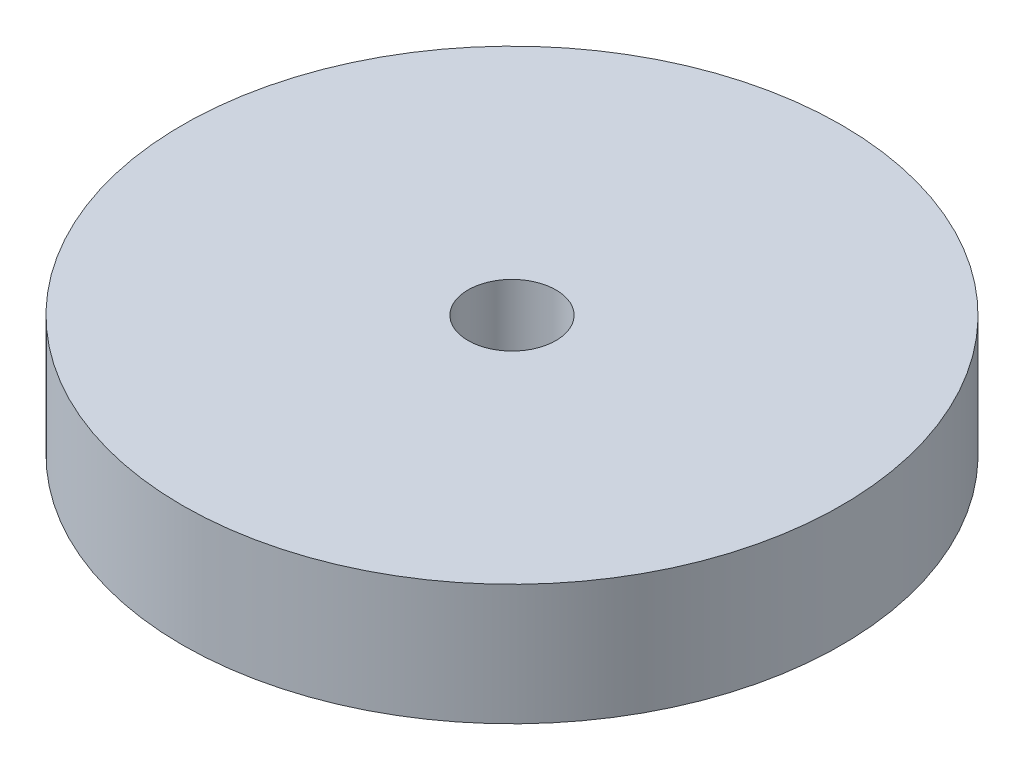
ISO-10303-21;
HEADER;
FILE_DESCRIPTION(('STEP AP214'),'2;1');
FILE_NAME('part.step','',(''),(''),'','','');
FILE_SCHEMA(('AUTOMOTIVE_DESIGN { 1 0 10303 214 1 1 1 1 }'));
ENDSEC;
DATA;
#1=APPLICATION_CONTEXT('core data for automotive mechanical design processes');
#2=APPLICATION_PROTOCOL_DEFINITION('international standard','automotive_design',2000,#1);
#3=PRODUCT_CONTEXT('',#1,'mechanical');
#4=PRODUCT('Part','Part','',(#3));
#5=PRODUCT_RELATED_PRODUCT_CATEGORY('part','',(#4));
#6=PRODUCT_DEFINITION_FORMATION('','',#4);
#7=PRODUCT_DEFINITION_CONTEXT('part definition',#1,'design');
#8=PRODUCT_DEFINITION('design','',#6,#7);
#9=PRODUCT_DEFINITION_SHAPE('','',#8);
#10=(LENGTH_UNIT() NAMED_UNIT(*) SI_UNIT(.MILLI.,.METRE.));
#11=(NAMED_UNIT(*) PLANE_ANGLE_UNIT() SI_UNIT($,.RADIAN.));
#12=(NAMED_UNIT(*) SI_UNIT($,.STERADIAN.) SOLID_ANGLE_UNIT());
#13=UNCERTAINTY_MEASURE_WITH_UNIT(LENGTH_MEASURE(1.E-05),#10,'distance_accuracy_value','');
#14=(GEOMETRIC_REPRESENTATION_CONTEXT(3) GLOBAL_UNCERTAINTY_ASSIGNED_CONTEXT((#13)) GLOBAL_UNIT_ASSIGNED_CONTEXT((#10,
#11,#12)) REPRESENTATION_CONTEXT('',''));
#15=CARTESIAN_POINT('',(0.,0.,0.));
#16=DIRECTION('',(0.,0.,1.));
#17=DIRECTION('',(1.,0.,0.));
#18=AXIS2_PLACEMENT_3D('',#15,#16,#17);
#19=CARTESIAN_POINT('',(0.,5.5,0.));
#20=DIRECTION('',(0.,-1.,0.));
#21=DIRECTION('',(0.,0.,-1.));
#22=AXIS2_PLACEMENT_3D('',#19,#20,#21);
#23=CYLINDRICAL_SURFACE('',#22,15.);
#24=CARTESIAN_POINT('',(0.,5.5,0.));
#25=DIRECTION('',(0.,1.,0.));
#26=DIRECTION('',(0.,0.,1.));
#27=AXIS2_PLACEMENT_3D('',#24,#25,#26);
#28=CIRCLE('',#27,15.);
#29=CARTESIAN_POINT('',(0.,5.5,15.));
#30=VERTEX_POINT('',#29);
#31=EDGE_CURVE('E10',#30,#30,#28,.T.);
#32=ORIENTED_EDGE('',*,*,#31,.F.);
#33=EDGE_LOOP('',(#32));
#34=FACE_BOUND('',#33,.T.);
#35=CARTESIAN_POINT('',(0.,0.,0.));
#36=DIRECTION('',(0.,1.,0.));
#37=DIRECTION('',(0.,0.,1.));
#38=AXIS2_PLACEMENT_3D('',#35,#36,#37);
#39=CIRCLE('',#38,15.);
#40=CARTESIAN_POINT('',(0.,0.,15.));
#41=VERTEX_POINT('',#40);
#42=EDGE_CURVE('E34',#41,#41,#39,.T.);
#43=ORIENTED_EDGE('',*,*,#42,.T.);
#44=EDGE_LOOP('',(#43));
#45=FACE_BOUND('',#44,.T.);
#46=ADVANCED_FACE('F31',(#34,#45),#23,.T.);
#47=CARTESIAN_POINT('',(0.,5.5,0.));
#48=DIRECTION('',(0.,1.,0.));
#49=DIRECTION('',(0.,0.,1.));
#50=AXIS2_PLACEMENT_3D('',#47,#48,#49);
#51=PLANE('',#50);
#52=CARTESIAN_POINT('',(0.,5.5,0.));
#53=DIRECTION('',(0.,1.,0.));
#54=DIRECTION('',(0.,0.,1.));
#55=AXIS2_PLACEMENT_3D('',#52,#53,#54);
#56=CIRCLE('',#55,2.);
#57=CARTESIAN_POINT('',(0.,5.5,2.));
#58=VERTEX_POINT('',#57);
#59=EDGE_CURVE('E43',#58,#58,#56,.T.);
#60=ORIENTED_EDGE('',*,*,#59,.F.);
#61=EDGE_LOOP('',(#60));
#62=FACE_BOUND('',#61,.T.);
#63=ORIENTED_EDGE('',*,*,#31,.T.);
#64=EDGE_LOOP('',(#63));
#65=FACE_BOUND('',#64,.T.);
#66=ADVANCED_FACE('F58',(#62,#65),#51,.T.);
#67=CARTESIAN_POINT('',(0.,0.,0.));
#68=DIRECTION('',(0.,1.,0.));
#69=DIRECTION('',(0.,0.,1.));
#70=AXIS2_PLACEMENT_3D('',#67,#68,#69);
#71=PLANE('',#70);
#72=CARTESIAN_POINT('',(0.,0.,0.));
#73=DIRECTION('',(0.,1.,0.));
#74=DIRECTION('',(0.,0.,1.));
#75=AXIS2_PLACEMENT_3D('',#72,#73,#74);
#76=CIRCLE('',#75,2.);
#77=CARTESIAN_POINT('',(0.,0.,2.));
#78=VERTEX_POINT('',#77);
#79=EDGE_CURVE('E41',#78,#78,#76,.T.);
#80=ORIENTED_EDGE('',*,*,#79,.T.);
#81=EDGE_LOOP('',(#80));
#82=FACE_BOUND('',#81,.T.);
#83=ORIENTED_EDGE('',*,*,#42,.F.);
#84=EDGE_LOOP('',(#83));
#85=FACE_BOUND('',#84,.T.);
#86=ADVANCED_FACE('F49',(#82,#85),#71,.F.);
#87=CARTESIAN_POINT('',(0.,0.,0.));
#88=DIRECTION('',(0.,1.,0.));
#89=DIRECTION('',(0.,0.,1.));
#90=AXIS2_PLACEMENT_3D('',#87,#88,#89);
#91=CYLINDRICAL_SURFACE('',#90,2.);
#92=ORIENTED_EDGE('',*,*,#79,.F.);
#93=EDGE_LOOP('',(#92));
#94=FACE_BOUND('',#93,.T.);
#95=ORIENTED_EDGE('',*,*,#59,.T.);
#96=EDGE_LOOP('',(#95));
#97=FACE_BOUND('',#96,.T.);
#98=ADVANCED_FACE('F52',(#94,#97),#91,.F.);
#99=CLOSED_SHELL('',(#46,#66,#86,#98));
#100=MANIFOLD_SOLID_BREP('B2',#99);
#101=ADVANCED_BREP_SHAPE_REPRESENTATION('',(#18,#100),#14);
#102=SHAPE_DEFINITION_REPRESENTATION(#9,#101);
ENDSEC;
END-ISO-10303-21;
